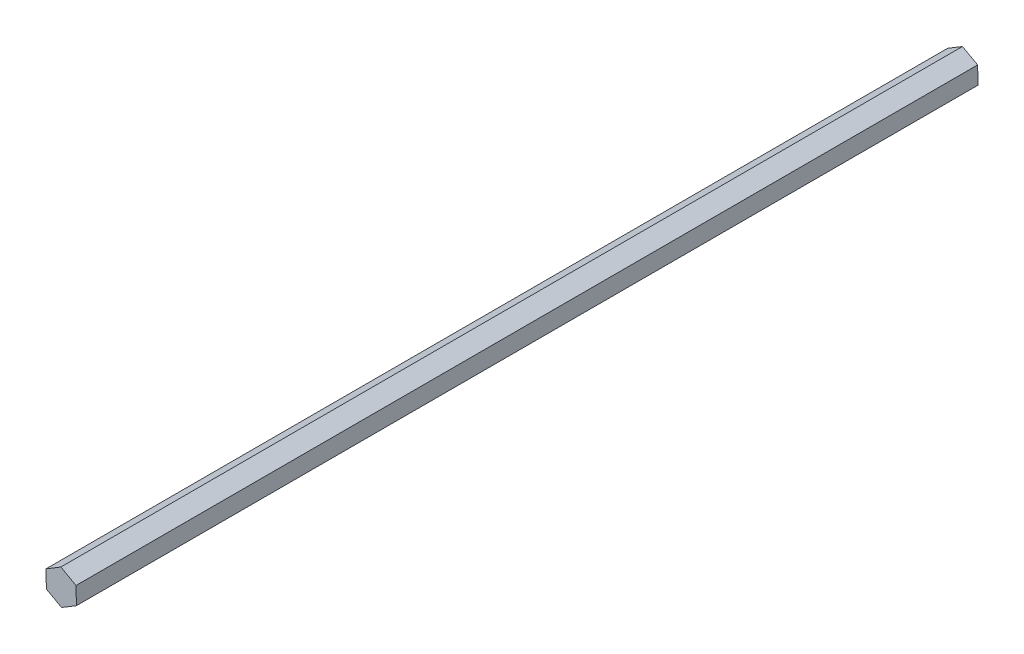
ISO-10303-21;
HEADER;
FILE_DESCRIPTION(('STEP AP214'),'2;1');
FILE_NAME('part.step','',(''),(''),'','','');
FILE_SCHEMA(('AUTOMOTIVE_DESIGN { 1 0 10303 214 1 1 1 1 }'));
ENDSEC;
DATA;
#1=APPLICATION_CONTEXT('core data for automotive mechanical design processes');
#2=APPLICATION_PROTOCOL_DEFINITION('international standard','automotive_design',2000,#1);
#3=PRODUCT_CONTEXT('',#1,'mechanical');
#4=PRODUCT('Part','Part','',(#3));
#5=PRODUCT_RELATED_PRODUCT_CATEGORY('part','',(#4));
#6=PRODUCT_DEFINITION_FORMATION('','',#4);
#7=PRODUCT_DEFINITION_CONTEXT('part definition',#1,'design');
#8=PRODUCT_DEFINITION('design','',#6,#7);
#9=PRODUCT_DEFINITION_SHAPE('','',#8);
#10=(LENGTH_UNIT() NAMED_UNIT(*) SI_UNIT(.MILLI.,.METRE.));
#11=(NAMED_UNIT(*) PLANE_ANGLE_UNIT() SI_UNIT($,.RADIAN.));
#12=(NAMED_UNIT(*) SI_UNIT($,.STERADIAN.) SOLID_ANGLE_UNIT());
#13=UNCERTAINTY_MEASURE_WITH_UNIT(LENGTH_MEASURE(1.E-05),#10,'distance_accuracy_value','');
#14=(GEOMETRIC_REPRESENTATION_CONTEXT(3) GLOBAL_UNCERTAINTY_ASSIGNED_CONTEXT((#13)) GLOBAL_UNIT_ASSIGNED_CONTEXT((#10,
#11,#12)) REPRESENTATION_CONTEXT('',''));
#15=CARTESIAN_POINT('',(0.,0.,0.));
#16=DIRECTION('',(0.,0.,1.));
#17=DIRECTION('',(1.,0.,0.));
#18=AXIS2_PLACEMENT_3D('',#15,#16,#17);
#19=CARTESIAN_POINT('',(6.27239740600557,3.79741545191831,381.));
#20=DIRECTION('',(-0.481884870781381,-0.876234541268496,0.));
#21=DIRECTION('',(0.876234541268496,-0.481884870781381,0.));
#22=AXIS2_PLACEMENT_3D('',#19,#20,#21);
#23=PLANE('',#22);
#24=DIRECTION('',(-0.876234541268496,0.481884870781381,0.));
#25=VECTOR('',#24,1.);
#26=CARTESIAN_POINT('',(6.27239740600557,3.79741545191831,0.));
#27=LINE('',#26,#25);
#28=CARTESIAN_POINT('',(6.27239740600557,3.79741545191831,0.));
#29=VERTEX_POINT('',#28);
#30=CARTESIAN_POINT('',(-0.152459547082034,7.3307632221916,0.));
#31=VERTEX_POINT('',#30);
#32=EDGE_CURVE('E117',#29,#31,#27,.T.);
#33=ORIENTED_EDGE('',*,*,#32,.T.);
#34=DIRECTION('',(0.,0.,-1.));
#35=VECTOR('',#34,1.);
#36=CARTESIAN_POINT('',(-0.152459547082034,7.3307632221916,381.));
#37=LINE('',#36,#35);
#38=CARTESIAN_POINT('',(-0.152459547082034,7.3307632221916,381.));
#39=VERTEX_POINT('',#38);
#40=EDGE_CURVE('E11',#39,#31,#37,.T.);
#41=ORIENTED_EDGE('',*,*,#40,.F.);
#42=DIRECTION('',(-0.876234541268496,0.481884870781381,0.));
#43=VECTOR('',#42,1.);
#44=CARTESIAN_POINT('',(6.27239740600557,3.79741545191831,381.));
#45=LINE('',#44,#43);
#46=CARTESIAN_POINT('',(6.27239740600557,3.79741545191831,381.));
#47=VERTEX_POINT('',#46);
#48=EDGE_CURVE('E127',#47,#39,#45,.T.);
#49=ORIENTED_EDGE('',*,*,#48,.F.);
#50=DIRECTION('',(0.,0.,-1.));
#51=VECTOR('',#50,1.);
#52=CARTESIAN_POINT('',(6.27239740600557,3.79741545191831,381.));
#53=LINE('',#52,#51);
#54=EDGE_CURVE('E113',#47,#29,#53,.T.);
#55=ORIENTED_EDGE('',*,*,#54,.T.);
#56=EDGE_LOOP('',(#33,#41,#49,#55));
#57=FACE_BOUND('',#56,.T.);
#58=ADVANCED_FACE('F33',(#57),#23,.F.);
#59=CARTESIAN_POINT('',(-0.152459547082034,7.3307632221916,381.));
#60=DIRECTION('',(0.517898937021232,-0.855441810430305,0.));
#61=DIRECTION('',(0.855441810430305,0.517898937021232,0.));
#62=AXIS2_PLACEMENT_3D('',#59,#60,#61);
#63=PLANE('',#62);
#64=DIRECTION('',(-0.855441810430305,-0.517898937021232,0.));
#65=VECTOR('',#64,1.);
#66=CARTESIAN_POINT('',(-0.152459547082034,7.3307632221916,0.));
#67=LINE('',#66,#65);
#68=CARTESIAN_POINT('',(-6.4248569530876,3.53334777027328,0.));
#69=VERTEX_POINT('',#68);
#70=EDGE_CURVE('E120',#31,#69,#67,.T.);
#71=ORIENTED_EDGE('',*,*,#70,.T.);
#72=DIRECTION('',(0.,0.,-1.));
#73=VECTOR('',#72,1.);
#74=CARTESIAN_POINT('',(-6.4248569530876,3.53334777027328,381.));
#75=LINE('',#74,#73);
#76=CARTESIAN_POINT('',(-6.4248569530876,3.53334777027328,381.));
#77=VERTEX_POINT('',#76);
#78=EDGE_CURVE('E41',#77,#69,#75,.T.);
#79=ORIENTED_EDGE('',*,*,#78,.F.);
#80=DIRECTION('',(-0.855441810430305,-0.517898937021232,0.));
#81=VECTOR('',#80,1.);
#82=CARTESIAN_POINT('',(-0.152459547082034,7.3307632221916,381.));
#83=LINE('',#82,#81);
#84=EDGE_CURVE('E86',#39,#77,#83,.T.);
#85=ORIENTED_EDGE('',*,*,#84,.F.);
#86=ORIENTED_EDGE('',*,*,#40,.T.);
#87=EDGE_LOOP('',(#71,#79,#85,#86));
#88=FACE_BOUND('',#87,.T.);
#89=ADVANCED_FACE('F151',(#88),#63,.F.);
#90=CARTESIAN_POINT('',(-6.4248569530876,3.53334777027328,381.));
#91=DIRECTION('',(0.999783807802612,0.0207927308381908,0.));
#92=DIRECTION('',(-0.0207927308381908,0.999783807802612,0.));
#93=AXIS2_PLACEMENT_3D('',#90,#91,#92);
#94=PLANE('',#93);
#95=DIRECTION('',(0.0207927308381908,-0.999783807802612,0.));
#96=VECTOR('',#95,1.);
#97=CARTESIAN_POINT('',(-6.4248569530876,3.53334777027328,0.));
#98=LINE('',#97,#96);
#99=CARTESIAN_POINT('',(-6.27239740600557,-3.79741545191831,0.));
#100=VERTEX_POINT('',#99);
#101=EDGE_CURVE('E122',#69,#100,#98,.T.);
#102=ORIENTED_EDGE('',*,*,#101,.T.);
#103=DIRECTION('',(0.,0.,-1.));
#104=VECTOR('',#103,1.);
#105=CARTESIAN_POINT('',(-6.27239740600557,-3.79741545191831,381.));
#106=LINE('',#105,#104);
#107=CARTESIAN_POINT('',(-6.27239740600557,-3.79741545191831,381.));
#108=VERTEX_POINT('',#107);
#109=EDGE_CURVE('E108',#108,#100,#106,.T.);
#110=ORIENTED_EDGE('',*,*,#109,.F.);
#111=DIRECTION('',(0.0207927308381908,-0.999783807802612,0.));
#112=VECTOR('',#111,1.);
#113=CARTESIAN_POINT('',(-6.4248569530876,3.53334777027328,381.));
#114=LINE('',#113,#112);
#115=EDGE_CURVE('E99',#77,#108,#114,.T.);
#116=ORIENTED_EDGE('',*,*,#115,.F.);
#117=ORIENTED_EDGE('',*,*,#78,.T.);
#118=EDGE_LOOP('',(#102,#110,#116,#117));
#119=FACE_BOUND('',#118,.T.);
#120=ADVANCED_FACE('F133',(#119),#94,.F.);
#121=CARTESIAN_POINT('',(-6.27239740600557,-3.79741545191831,381.));
#122=DIRECTION('',(0.481884870781381,0.876234541268496,0.));
#123=DIRECTION('',(-0.876234541268496,0.481884870781381,0.));
#124=AXIS2_PLACEMENT_3D('',#121,#122,#123);
#125=PLANE('',#124);
#126=DIRECTION('',(0.876234541268496,-0.481884870781381,0.));
#127=VECTOR('',#126,1.);
#128=CARTESIAN_POINT('',(-6.27239740600557,-3.79741545191831,0.));
#129=LINE('',#128,#127);
#130=CARTESIAN_POINT('',(0.152459547082032,-7.33076322219159,0.));
#131=VERTEX_POINT('',#130);
#132=EDGE_CURVE('E107',#100,#131,#129,.T.);
#133=ORIENTED_EDGE('',*,*,#132,.T.);
#134=DIRECTION('',(0.,0.,-1.));
#135=VECTOR('',#134,1.);
#136=CARTESIAN_POINT('',(0.152459547082032,-7.33076322219159,381.));
#137=LINE('',#136,#135);
#138=CARTESIAN_POINT('',(0.152459547082032,-7.33076322219159,381.));
#139=VERTEX_POINT('',#138);
#140=EDGE_CURVE('E104',#139,#131,#137,.T.);
#141=ORIENTED_EDGE('',*,*,#140,.F.);
#142=DIRECTION('',(0.876234541268496,-0.481884870781381,0.));
#143=VECTOR('',#142,1.);
#144=CARTESIAN_POINT('',(-6.27239740600557,-3.79741545191831,381.));
#145=LINE('',#144,#143);
#146=EDGE_CURVE('E93',#108,#139,#145,.T.);
#147=ORIENTED_EDGE('',*,*,#146,.F.);
#148=ORIENTED_EDGE('',*,*,#109,.T.);
#149=EDGE_LOOP('',(#133,#141,#147,#148));
#150=FACE_BOUND('',#149,.T.);
#151=ADVANCED_FACE('F105',(#150),#125,.F.);
#152=CARTESIAN_POINT('',(0.152459547082032,-7.33076322219159,381.));
#153=DIRECTION('',(-0.517898937021231,0.855441810430306,0.));
#154=DIRECTION('',(-0.855441810430306,-0.517898937021231,0.));
#155=AXIS2_PLACEMENT_3D('',#152,#153,#154);
#156=PLANE('',#155);
#157=DIRECTION('',(0.855441810430306,0.517898937021231,0.));
#158=VECTOR('',#157,1.);
#159=CARTESIAN_POINT('',(0.152459547082032,-7.33076322219159,0.));
#160=LINE('',#159,#158);
#161=CARTESIAN_POINT('',(6.4248569530876,-3.53334777027329,0.));
#162=VERTEX_POINT('',#161);
#163=EDGE_CURVE('E72',#131,#162,#160,.T.);
#164=ORIENTED_EDGE('',*,*,#163,.T.);
#165=DIRECTION('',(0.,0.,-1.));
#166=VECTOR('',#165,1.);
#167=CARTESIAN_POINT('',(6.4248569530876,-3.53334777027329,381.));
#168=LINE('',#167,#166);
#169=CARTESIAN_POINT('',(6.4248569530876,-3.53334777027329,381.));
#170=VERTEX_POINT('',#169);
#171=EDGE_CURVE('E109',#170,#162,#168,.T.);
#172=ORIENTED_EDGE('',*,*,#171,.F.);
#173=DIRECTION('',(0.855441810430306,0.517898937021231,0.));
#174=VECTOR('',#173,1.);
#175=CARTESIAN_POINT('',(0.152459547082032,-7.33076322219159,381.));
#176=LINE('',#175,#174);
#177=EDGE_CURVE('E97',#139,#170,#176,.T.);
#178=ORIENTED_EDGE('',*,*,#177,.F.);
#179=ORIENTED_EDGE('',*,*,#140,.T.);
#180=EDGE_LOOP('',(#164,#172,#178,#179));
#181=FACE_BOUND('',#180,.T.);
#182=ADVANCED_FACE('F111',(#181),#156,.F.);
#183=CARTESIAN_POINT('',(6.4248569530876,-3.53334777027329,381.));
#184=DIRECTION('',(-0.999783807802612,-0.0207927308381904,0.));
#185=DIRECTION('',(0.0207927308381904,-0.999783807802612,0.));
#186=AXIS2_PLACEMENT_3D('',#183,#184,#185);
#187=PLANE('',#186);
#188=DIRECTION('',(-0.0207927308381904,0.999783807802612,0.));
#189=VECTOR('',#188,1.);
#190=CARTESIAN_POINT('',(6.4248569530876,-3.53334777027329,0.));
#191=LINE('',#190,#189);
#192=EDGE_CURVE('E78',#162,#29,#191,.T.);
#193=ORIENTED_EDGE('',*,*,#192,.T.);
#194=ORIENTED_EDGE('',*,*,#54,.F.);
#195=DIRECTION('',(-0.0207927308381904,0.999783807802612,0.));
#196=VECTOR('',#195,1.);
#197=CARTESIAN_POINT('',(6.4248569530876,-3.53334777027329,381.));
#198=LINE('',#197,#196);
#199=EDGE_CURVE('E49',#170,#47,#198,.T.);
#200=ORIENTED_EDGE('',*,*,#199,.F.);
#201=ORIENTED_EDGE('',*,*,#171,.T.);
#202=EDGE_LOOP('',(#193,#194,#200,#201));
#203=FACE_BOUND('',#202,.T.);
#204=ADVANCED_FACE('F140',(#203),#187,.F.);
#205=CARTESIAN_POINT('',(0.,0.,381.));
#206=DIRECTION('',(0.,0.,1.));
#207=DIRECTION('',(1.,0.,0.));
#208=AXIS2_PLACEMENT_3D('',#205,#206,#207);
#209=PLANE('',#208);
#210=ORIENTED_EDGE('',*,*,#48,.T.);
#211=ORIENTED_EDGE('',*,*,#84,.T.);
#212=ORIENTED_EDGE('',*,*,#115,.T.);
#213=ORIENTED_EDGE('',*,*,#146,.T.);
#214=ORIENTED_EDGE('',*,*,#177,.T.);
#215=ORIENTED_EDGE('',*,*,#199,.T.);
#216=EDGE_LOOP('',(#210,#211,#212,#213,#214,#215));
#217=FACE_BOUND('',#216,.T.);
#218=ADVANCED_FACE('F95',(#217),#209,.T.);
#219=CARTESIAN_POINT('',(0.,0.,0.));
#220=DIRECTION('',(0.,0.,1.));
#221=DIRECTION('',(1.,0.,0.));
#222=AXIS2_PLACEMENT_3D('',#219,#220,#221);
#223=PLANE('',#222);
#224=ORIENTED_EDGE('',*,*,#32,.F.);
#225=ORIENTED_EDGE('',*,*,#192,.F.);
#226=ORIENTED_EDGE('',*,*,#163,.F.);
#227=ORIENTED_EDGE('',*,*,#132,.F.);
#228=ORIENTED_EDGE('',*,*,#101,.F.);
#229=ORIENTED_EDGE('',*,*,#70,.F.);
#230=EDGE_LOOP('',(#224,#225,#226,#227,#228,#229));
#231=FACE_BOUND('',#230,.T.);
#232=ADVANCED_FACE('F136',(#231),#223,.F.);
#233=CLOSED_SHELL('',(#58,#89,#120,#151,#182,#204,#218,#232));
#234=MANIFOLD_SOLID_BREP('B2',#233);
#235=ADVANCED_BREP_SHAPE_REPRESENTATION('',(#18,#234),#14);
#236=SHAPE_DEFINITION_REPRESENTATION(#9,#235);
ENDSEC;
END-ISO-10303-21;
